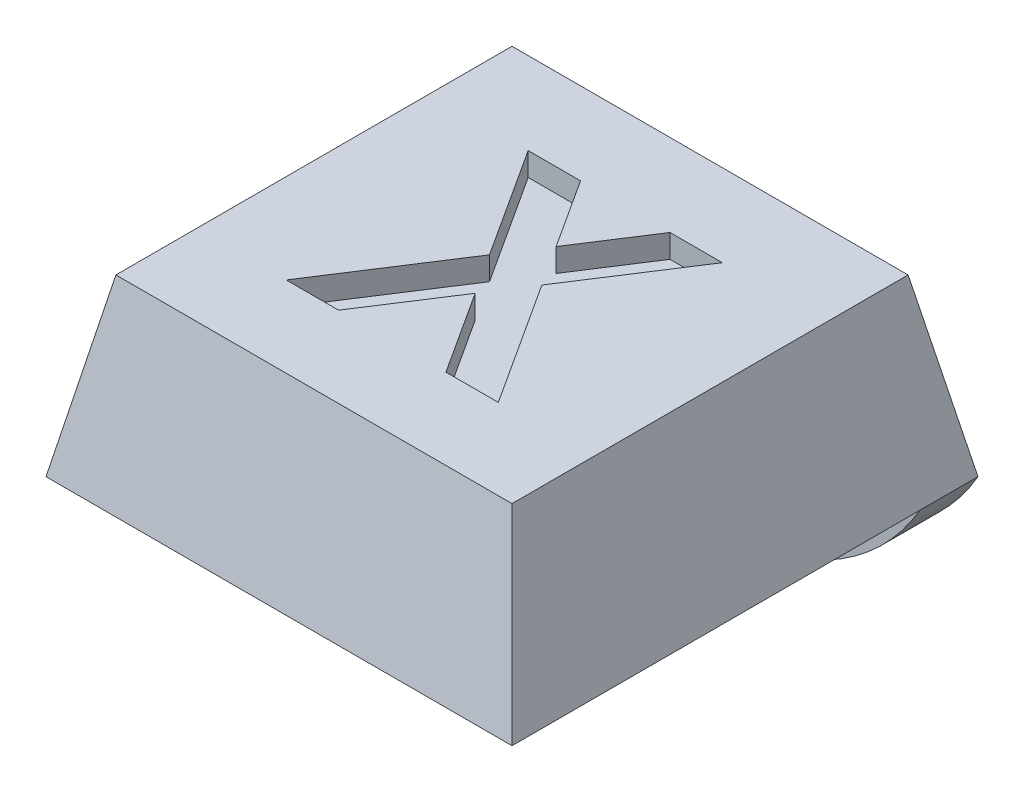
ISO-10303-21;
HEADER;
FILE_DESCRIPTION(('STEP AP214'),'2;1');
FILE_NAME('part.step','',(''),(''),'','','');
FILE_SCHEMA(('AUTOMOTIVE_DESIGN { 1 0 10303 214 1 1 1 1 }'));
ENDSEC;
DATA;
#1=APPLICATION_CONTEXT('core data for automotive mechanical design processes');
#2=APPLICATION_PROTOCOL_DEFINITION('international standard','automotive_design',2000,#1);
#3=PRODUCT_CONTEXT('',#1,'mechanical');
#4=PRODUCT('Part','Part','',(#3));
#5=PRODUCT_RELATED_PRODUCT_CATEGORY('part','',(#4));
#6=PRODUCT_DEFINITION_FORMATION('','',#4);
#7=PRODUCT_DEFINITION_CONTEXT('part definition',#1,'design');
#8=PRODUCT_DEFINITION('design','',#6,#7);
#9=PRODUCT_DEFINITION_SHAPE('','',#8);
#10=(LENGTH_UNIT() NAMED_UNIT(*) SI_UNIT(.MILLI.,.METRE.));
#11=(NAMED_UNIT(*) PLANE_ANGLE_UNIT() SI_UNIT($,.RADIAN.));
#12=(NAMED_UNIT(*) SI_UNIT($,.STERADIAN.) SOLID_ANGLE_UNIT());
#13=UNCERTAINTY_MEASURE_WITH_UNIT(LENGTH_MEASURE(1.E-05),#10,'distance_accuracy_value','');
#14=(GEOMETRIC_REPRESENTATION_CONTEXT(3) GLOBAL_UNCERTAINTY_ASSIGNED_CONTEXT((#13)) GLOBAL_UNIT_ASSIGNED_CONTEXT((#10,
#11,#12)) REPRESENTATION_CONTEXT('',''));
#15=CARTESIAN_POINT('',(0.,0.,0.));
#16=DIRECTION('',(0.,0.,1.));
#17=DIRECTION('',(1.,0.,0.));
#18=AXIS2_PLACEMENT_3D('',#15,#16,#17);
#19=CARTESIAN_POINT('',(0.,3.,0.));
#20=DIRECTION('',(0.,-1.,0.));
#21=DIRECTION('',(0.,0.,-1.));
#22=AXIS2_PLACEMENT_3D('',#19,#20,#21);
#23=PLANE('',#22);
#24=DIRECTION('',(-1.,0.,0.));
#25=VECTOR('',#24,1.);
#26=CARTESIAN_POINT('',(11.,3.,-0.6));
#27=LINE('',#26,#25);
#28=CARTESIAN_POINT('',(7.4,3.,-0.6));
#29=VERTEX_POINT('',#28);
#30=CARTESIAN_POINT('',(0.6,3.,-0.6));
#31=VERTEX_POINT('',#30);
#32=EDGE_CURVE('E229',#29,#31,#27,.T.);
#33=ORIENTED_EDGE('',*,*,#32,.F.);
#34=DIRECTION('',(0.,0.,1.));
#35=VECTOR('',#34,1.);
#36=CARTESIAN_POINT('',(7.4,3.,-8.));
#37=LINE('',#36,#35);
#38=CARTESIAN_POINT('',(7.4,3.,-7.4));
#39=VERTEX_POINT('',#38);
#40=EDGE_CURVE('E242',#39,#29,#37,.T.);
#41=ORIENTED_EDGE('',*,*,#40,.F.);
#42=DIRECTION('',(-1.,0.,0.));
#43=VECTOR('',#42,1.);
#44=CARTESIAN_POINT('',(11.,3.,-7.4));
#45=LINE('',#44,#43);
#46=CARTESIAN_POINT('',(0.599999999999999,3.,-7.4));
#47=VERTEX_POINT('',#46);
#48=EDGE_CURVE('E225',#39,#47,#45,.T.);
#49=ORIENTED_EDGE('',*,*,#48,.T.);
#50=DIRECTION('',(0.,0.,1.));
#51=VECTOR('',#50,1.);
#52=CARTESIAN_POINT('',(0.6,3.,-8.));
#53=LINE('',#52,#51);
#54=EDGE_CURVE('E245',#47,#31,#53,.T.);
#55=ORIENTED_EDGE('',*,*,#54,.T.);
#56=EDGE_LOOP('',(#33,#41,#49,#55));
#57=FACE_BOUND('',#56,.T.);
#58=DIRECTION('',(-1.,0.,0.));
#59=VECTOR('',#58,1.);
#60=CARTESIAN_POINT('',(3.03551556297444,3.,-1.98743460523464));
#61=LINE('',#60,#59);
#62=CARTESIAN_POINT('',(3.03551556297444,3.,-1.98743460523464));
#63=VERTEX_POINT('',#62);
#64=CARTESIAN_POINT('',(2.13647710143598,3.,-1.98743460523464));
#65=VERTEX_POINT('',#64);
#66=EDGE_CURVE('E58',#63,#65,#61,.T.);
#67=ORIENTED_EDGE('',*,*,#66,.T.);
#68=DIRECTION('',(0.543290774968153,0.,-0.839544599074107));
#69=VECTOR('',#68,1.);
#70=CARTESIAN_POINT('',(2.13647710143598,3.,-1.98743460523464));
#71=LINE('',#70,#69);
#72=CARTESIAN_POINT('',(3.50747069117957,3.,-4.10602434882438));
#73=VERTEX_POINT('',#72);
#74=EDGE_CURVE('E197',#65,#73,#71,.T.);
#75=ORIENTED_EDGE('',*,*,#74,.T.);
#76=DIRECTION('',(-0.543177141809505,0.,-0.839618123086714));
#77=VECTOR('',#76,1.);
#78=CARTESIAN_POINT('',(3.50747069117957,3.,-4.10602434882438));
#79=LINE('',#78,#77);
#80=CARTESIAN_POINT('',(2.29032325528213,3.,-5.98743460523464));
#81=VERTEX_POINT('',#80);
#82=EDGE_CURVE('E666',#73,#81,#79,.T.);
#83=ORIENTED_EDGE('',*,*,#82,.T.);
#84=DIRECTION('',(1.,0.,0.));
#85=VECTOR('',#84,1.);
#86=CARTESIAN_POINT('',(2.29032325528213,3.,-5.98743460523464));
#87=LINE('',#86,#85);
#88=CARTESIAN_POINT('',(3.18936171682059,3.,-5.98743460523464));
#89=VERTEX_POINT('',#88);
#90=EDGE_CURVE('E668',#81,#89,#87,.T.);
#91=ORIENTED_EDGE('',*,*,#90,.T.);
#92=DIRECTION('',(0.543133735363525,0.,0.839646202581816));
#93=VECTOR('',#92,1.);
#94=CARTESIAN_POINT('',(3.18936171682059,3.,-5.98743460523464));
#95=LINE('',#94,#93);
#96=CARTESIAN_POINT('',(3.9569899219488,3.,-4.80073588728592));
#97=VERTEX_POINT('',#96);
#98=EDGE_CURVE('E673',#89,#97,#95,.T.);
#99=ORIENTED_EDGE('',*,*,#98,.T.);
#100=DIRECTION('',(0.543133735363525,0.,-0.839646202581816));
#101=VECTOR('',#100,1.);
#102=CARTESIAN_POINT('',(3.9569899219488,3.,-4.80073588728592));
#103=LINE('',#102,#101);
#104=CARTESIAN_POINT('',(4.724618127077,3.,-5.98743460523464));
#105=VERTEX_POINT('',#104);
#106=EDGE_CURVE('E683',#97,#105,#103,.T.);
#107=ORIENTED_EDGE('',*,*,#106,.T.);
#108=DIRECTION('',(1.,0.,0.));
#109=VECTOR('',#108,1.);
#110=CARTESIAN_POINT('',(4.724618127077,3.,-5.98743460523464));
#111=LINE('',#110,#109);
#112=CARTESIAN_POINT('',(5.62365658861547,3.,-5.98743460523464));
#113=VERTEX_POINT('',#112);
#114=EDGE_CURVE('E687',#105,#113,#111,.T.);
#115=ORIENTED_EDGE('',*,*,#114,.T.);
#116=DIRECTION('',(-0.543177141809505,0.,0.839618123086714));
#117=VECTOR('',#116,1.);
#118=CARTESIAN_POINT('',(5.62365658861547,3.,-5.98743460523464));
#119=LINE('',#118,#117);
#120=CARTESIAN_POINT('',(4.40650915271803,3.,-4.10602434882438));
#121=VERTEX_POINT('',#120);
#122=EDGE_CURVE('E691',#113,#121,#119,.T.);
#123=ORIENTED_EDGE('',*,*,#122,.T.);
#124=DIRECTION('',(0.543290774968153,0.,0.839544599074107));
#125=VECTOR('',#124,1.);
#126=CARTESIAN_POINT('',(4.40650915271803,3.,-4.10602434882438));
#127=LINE('',#126,#125);
#128=CARTESIAN_POINT('',(5.77750274246162,3.,-1.98743460523464));
#129=VERTEX_POINT('',#128);
#130=EDGE_CURVE('E632',#121,#129,#127,.T.);
#131=ORIENTED_EDGE('',*,*,#130,.T.);
#132=DIRECTION('',(-1.,0.,0.));
#133=VECTOR('',#132,1.);
#134=CARTESIAN_POINT('',(5.77750274246162,3.,-1.98743460523464));
#135=LINE('',#134,#133);
#136=CARTESIAN_POINT('',(4.87846428092316,3.,-1.98743460523464));
#137=VERTEX_POINT('',#136);
#138=EDGE_CURVE('E627',#129,#137,#135,.T.);
#139=ORIENTED_EDGE('',*,*,#138,.T.);
#140=DIRECTION('',(-0.543310044190695,0.,-0.839532129153795));
#141=VECTOR('',#140,1.);
#142=CARTESIAN_POINT('',(4.87846428092316,3.,-1.98743460523464));
#143=LINE('',#142,#141);
#144=CARTESIAN_POINT('',(3.9569899219488,3.,-3.41131281036285));
#145=VERTEX_POINT('',#144);
#146=EDGE_CURVE('E621',#137,#145,#143,.T.);
#147=ORIENTED_EDGE('',*,*,#146,.T.);
#148=DIRECTION('',(-0.543310044190695,0.,0.839532129153795));
#149=VECTOR('',#148,1.);
#150=CARTESIAN_POINT('',(3.9569899219488,3.,-3.41131281036285));
#151=LINE('',#150,#149);
#152=EDGE_CURVE('E193',#145,#63,#151,.T.);
#153=ORIENTED_EDGE('',*,*,#152,.T.);
#154=EDGE_LOOP('',(#67,#75,#83,#91,#99,#107,#115,#123,#131,#139,#147,#153));
#155=FACE_BOUND('',#154,.T.);
#156=ADVANCED_FACE('F42',(#57,#155),#23,.F.);
#157=CARTESIAN_POINT('',(8.,0.,-8.));
#158=DIRECTION('',(-0.98058067569092,-0.196116135138184,0.));
#159=DIRECTION('',(0.196116135138184,-0.98058067569092,0.));
#160=AXIS2_PLACEMENT_3D('',#157,#158,#159);
#161=PLANE('',#160);
#162=DIRECTION('',(-0.192450089729875,0.962250448649376,-0.192450089729875));
#163=VECTOR('',#162,1.);
#164=CARTESIAN_POINT('',(7.7037037037037,1.48148148148148,-0.296296296296296));
#165=LINE('',#164,#163);
#166=CARTESIAN_POINT('',(8.,0.,0.));
#167=VERTEX_POINT('',#166);
#168=EDGE_CURVE('E239',#167,#29,#165,.T.);
#169=ORIENTED_EDGE('',*,*,#168,.F.);
#170=DIRECTION('',(0.,0.,-1.));
#171=VECTOR('',#170,1.);
#172=CARTESIAN_POINT('',(8.,0.,0.));
#173=LINE('',#172,#171);
#174=CARTESIAN_POINT('',(8.,0.,-7.));
#175=VERTEX_POINT('',#174);
#176=EDGE_CURVE('E258',#167,#175,#173,.T.);
#177=ORIENTED_EDGE('',*,*,#176,.T.);
#178=DIRECTION('',(0.,0.,1.));
#179=VECTOR('',#178,1.);
#180=CARTESIAN_POINT('',(8.,0.,-8.));
#181=LINE('',#180,#179);
#182=CARTESIAN_POINT('',(8.,0.,-8.));
#183=VERTEX_POINT('',#182);
#184=EDGE_CURVE('E199',#183,#175,#181,.T.);
#185=ORIENTED_EDGE('',*,*,#184,.F.);
#186=DIRECTION('',(0.192450089729875,-0.962250448649376,-0.192450089729875));
#187=VECTOR('',#186,1.);
#188=CARTESIAN_POINT('',(8.,0.,-8.));
#189=LINE('',#188,#187);
#190=EDGE_CURVE('E232',#39,#183,#189,.T.);
#191=ORIENTED_EDGE('',*,*,#190,.F.);
#192=ORIENTED_EDGE('',*,*,#40,.T.);
#193=EDGE_LOOP('',(#169,#177,#185,#191,#192));
#194=FACE_BOUND('',#193,.T.);
#195=ADVANCED_FACE('F326',(#194),#161,.F.);
#196=CARTESIAN_POINT('',(0.,0.,-8.));
#197=DIRECTION('',(0.98058067569092,-0.196116135138184,0.));
#198=DIRECTION('',(0.196116135138184,0.98058067569092,0.));
#199=AXIS2_PLACEMENT_3D('',#196,#197,#198);
#200=PLANE('',#199);
#201=DIRECTION('',(-0.192450089729875,-0.962250448649376,0.192450089729875));
#202=VECTOR('',#201,1.);
#203=CARTESIAN_POINT('',(0.296296296296296,1.48148148148148,-0.296296296296296));
#204=LINE('',#203,#202);
#205=CARTESIAN_POINT('',(0.,0.,0.));
#206=VERTEX_POINT('',#205);
#207=EDGE_CURVE('E286',#31,#206,#204,.T.);
#208=ORIENTED_EDGE('',*,*,#207,.F.);
#209=ORIENTED_EDGE('',*,*,#54,.F.);
#210=DIRECTION('',(0.192450089729875,0.962250448649376,0.192450089729875));
#211=VECTOR('',#210,1.);
#212=CARTESIAN_POINT('',(0.,0.,-8.));
#213=LINE('',#212,#211);
#214=CARTESIAN_POINT('',(0.,0.,-8.));
#215=VERTEX_POINT('',#214);
#216=EDGE_CURVE('E257',#215,#47,#213,.T.);
#217=ORIENTED_EDGE('',*,*,#216,.F.);
#218=DIRECTION('',(0.,0.,1.));
#219=VECTOR('',#218,1.);
#220=CARTESIAN_POINT('',(0.,0.,0.));
#221=LINE('',#220,#219);
#222=CARTESIAN_POINT('',(0.,0.,-7.));
#223=VERTEX_POINT('',#222);
#224=EDGE_CURVE('E262',#215,#223,#221,.T.);
#225=ORIENTED_EDGE('',*,*,#224,.T.);
#226=EDGE_CURVE('E249',#223,#206,#221,.T.);
#227=ORIENTED_EDGE('',*,*,#226,.T.);
#228=EDGE_LOOP('',(#208,#209,#217,#225,#227));
#229=FACE_BOUND('',#228,.T.);
#230=ADVANCED_FACE('F310',(#229),#200,.F.);
#231=CARTESIAN_POINT('',(0.,0.,0.));
#232=DIRECTION('',(0.,-1.,0.));
#233=DIRECTION('',(0.,0.,-1.));
#234=AXIS2_PLACEMENT_3D('',#231,#232,#233);
#235=PLANE('',#234);
#236=DIRECTION('',(-1.,0.,0.));
#237=VECTOR('',#236,1.);
#238=CARTESIAN_POINT('',(0.,0.,-7.));
#239=LINE('',#238,#237);
#240=EDGE_CURVE('E205',#175,#223,#239,.T.);
#241=ORIENTED_EDGE('',*,*,#240,.F.);
#242=ORIENTED_EDGE('',*,*,#176,.F.);
#243=DIRECTION('',(1.,0.,0.));
#244=VECTOR('',#243,1.);
#245=CARTESIAN_POINT('',(0.,0.,0.));
#246=LINE('',#245,#244);
#247=EDGE_CURVE('E259',#206,#167,#246,.T.);
#248=ORIENTED_EDGE('',*,*,#247,.F.);
#249=ORIENTED_EDGE('',*,*,#226,.F.);
#250=EDGE_LOOP('',(#241,#242,#248,#249));
#251=FACE_BOUND('',#250,.T.);
#252=CARTESIAN_POINT('',(4.,0.,-3.75));
#253=DIRECTION('',(0.,-1.,0.));
#254=DIRECTION('',(0.,0.,-1.));
#255=AXIS2_PLACEMENT_3D('',#252,#253,#254);
#256=CIRCLE('',#255,1.8);
#257=CARTESIAN_POINT('',(4.,0.,-5.55));
#258=VERTEX_POINT('',#257);
#259=EDGE_CURVE('E217',#258,#258,#256,.T.);
#260=ORIENTED_EDGE('',*,*,#259,.F.);
#261=EDGE_LOOP('',(#260));
#262=FACE_BOUND('',#261,.T.);
#263=ADVANCED_FACE('F321',(#251,#262),#235,.T.);
#264=CARTESIAN_POINT('',(11.,3.,-7.4));
#265=DIRECTION('',(0.,0.196116135138184,-0.98058067569092));
#266=DIRECTION('',(0.,0.98058067569092,0.196116135138184));
#267=AXIS2_PLACEMENT_3D('',#264,#265,#266);
#268=PLANE('',#267);
#269=ORIENTED_EDGE('',*,*,#190,.T.);
#270=DIRECTION('',(-1.,0.,0.));
#271=VECTOR('',#270,1.);
#272=CARTESIAN_POINT('',(0.,0.,-8.));
#273=LINE('',#272,#271);
#274=EDGE_CURVE('E253',#183,#215,#273,.T.);
#275=ORIENTED_EDGE('',*,*,#274,.T.);
#276=ORIENTED_EDGE('',*,*,#216,.T.);
#277=ORIENTED_EDGE('',*,*,#48,.F.);
#278=EDGE_LOOP('',(#269,#275,#276,#277));
#279=FACE_BOUND('',#278,.T.);
#280=ADVANCED_FACE('F305',(#279),#268,.T.);
#281=CARTESIAN_POINT('',(11.,0.,0.));
#282=DIRECTION('',(0.,0.196116135138184,0.98058067569092));
#283=DIRECTION('',(0.,-0.98058067569092,0.196116135138184));
#284=AXIS2_PLACEMENT_3D('',#281,#282,#283);
#285=PLANE('',#284);
#286=ORIENTED_EDGE('',*,*,#168,.T.);
#287=ORIENTED_EDGE('',*,*,#32,.T.);
#288=ORIENTED_EDGE('',*,*,#207,.T.);
#289=ORIENTED_EDGE('',*,*,#247,.T.);
#290=EDGE_LOOP('',(#286,#287,#288,#289));
#291=FACE_BOUND('',#290,.T.);
#292=ADVANCED_FACE('F352',(#291),#285,.T.);
#293=CARTESIAN_POINT('',(4.,0.8,-3.75));
#294=DIRECTION('',(0.,-1.,0.));
#295=DIRECTION('',(0.,0.,-1.));
#296=AXIS2_PLACEMENT_3D('',#293,#294,#295);
#297=CYLINDRICAL_SURFACE('',#296,1.8);
#298=CARTESIAN_POINT('',(4.,0.8,-3.75));
#299=DIRECTION('',(0.,-1.,0.));
#300=DIRECTION('',(0.,0.,-1.));
#301=AXIS2_PLACEMENT_3D('',#298,#299,#300);
#302=CIRCLE('',#301,1.8);
#303=CARTESIAN_POINT('',(4.,0.8,-5.55));
#304=VERTEX_POINT('',#303);
#305=EDGE_CURVE('E221',#304,#304,#302,.T.);
#306=ORIENTED_EDGE('',*,*,#305,.F.);
#307=EDGE_LOOP('',(#306));
#308=FACE_BOUND('',#307,.T.);
#309=ORIENTED_EDGE('',*,*,#259,.T.);
#310=EDGE_LOOP('',(#309));
#311=FACE_BOUND('',#310,.T.);
#312=ADVANCED_FACE('F359',(#308,#311),#297,.F.);
#313=CARTESIAN_POINT('',(4.,0.8,-3.75));
#314=DIRECTION('',(0.,-1.,0.));
#315=DIRECTION('',(0.,0.,-1.));
#316=AXIS2_PLACEMENT_3D('',#313,#314,#315);
#317=PLANE('',#316);
#318=ORIENTED_EDGE('',*,*,#305,.T.);
#319=EDGE_LOOP('',(#318));
#320=FACE_BOUND('',#319,.T.);
#321=ADVANCED_FACE('F363',(#320),#317,.T.);
#322=CARTESIAN_POINT('',(0.,-2.,-8.));
#323=DIRECTION('',(0.,0.,1.));
#324=DIRECTION('',(1.,0.,0.));
#325=AXIS2_PLACEMENT_3D('',#322,#323,#324);
#326=PLANE('',#325);
#327=ORIENTED_EDGE('',*,*,#274,.F.);
#328=CARTESIAN_POINT('',(4.53589838486225,2.,-8.));
#329=DIRECTION('',(0.,0.,1.));
#330=DIRECTION('',(1.,0.,0.));
#331=AXIS2_PLACEMENT_3D('',#328,#329,#330);
#332=CIRCLE('',#331,4.);
#333=CARTESIAN_POINT('',(4.53589838486225,-2.,-8.));
#334=VERTEX_POINT('',#333);
#335=EDGE_CURVE('E11',#183,#334,#332,.F.);
#336=ORIENTED_EDGE('',*,*,#335,.T.);
#337=DIRECTION('',(1.,0.,0.));
#338=VECTOR('',#337,1.);
#339=CARTESIAN_POINT('',(0.,-2.,-8.));
#340=LINE('',#339,#338);
#341=CARTESIAN_POINT('',(3.46410161513775,-2.,-8.));
#342=VERTEX_POINT('',#341);
#343=EDGE_CURVE('E211',#342,#334,#340,.T.);
#344=ORIENTED_EDGE('',*,*,#343,.F.);
#345=CARTESIAN_POINT('',(3.46410161513775,2.,-8.));
#346=DIRECTION('',(0.,0.,1.));
#347=DIRECTION('',(1.,0.,0.));
#348=AXIS2_PLACEMENT_3D('',#345,#346,#347);
#349=CIRCLE('',#348,4.);
#350=EDGE_CURVE('E51',#342,#215,#349,.F.);
#351=ORIENTED_EDGE('',*,*,#350,.T.);
#352=EDGE_LOOP('',(#327,#336,#344,#351));
#353=FACE_BOUND('',#352,.T.);
#354=ADVANCED_FACE('F298',(#353),#326,.F.);
#355=CARTESIAN_POINT('',(0.,-2.,-7.));
#356=DIRECTION('',(0.,0.,-1.));
#357=DIRECTION('',(-1.,0.,0.));
#358=AXIS2_PLACEMENT_3D('',#355,#356,#357);
#359=PLANE('',#358);
#360=DIRECTION('',(-1.,0.,0.));
#361=VECTOR('',#360,1.);
#362=CARTESIAN_POINT('',(0.,-2.,-7.));
#363=LINE('',#362,#361);
#364=CARTESIAN_POINT('',(4.53589838486225,-2.,-7.));
#365=VERTEX_POINT('',#364);
#366=CARTESIAN_POINT('',(3.46410161513775,-2.,-7.));
#367=VERTEX_POINT('',#366);
#368=EDGE_CURVE('E215',#365,#367,#363,.T.);
#369=ORIENTED_EDGE('',*,*,#368,.F.);
#370=CARTESIAN_POINT('',(4.53589838486225,2.,-7.));
#371=DIRECTION('',(0.,0.,-1.));
#372=DIRECTION('',(-1.,0.,0.));
#373=AXIS2_PLACEMENT_3D('',#370,#371,#372);
#374=CIRCLE('',#373,4.);
#375=EDGE_CURVE('E292',#365,#175,#374,.F.);
#376=ORIENTED_EDGE('',*,*,#375,.T.);
#377=ORIENTED_EDGE('',*,*,#240,.T.);
#378=CARTESIAN_POINT('',(3.46410161513775,2.,-7.));
#379=DIRECTION('',(0.,0.,-1.));
#380=DIRECTION('',(-1.,0.,0.));
#381=AXIS2_PLACEMENT_3D('',#378,#379,#380);
#382=CIRCLE('',#381,4.);
#383=EDGE_CURVE('E66',#223,#367,#382,.F.);
#384=ORIENTED_EDGE('',*,*,#383,.T.);
#385=EDGE_LOOP('',(#369,#376,#377,#384));
#386=FACE_BOUND('',#385,.T.);
#387=ADVANCED_FACE('F316',(#386),#359,.F.);
#388=CARTESIAN_POINT('',(0.,-2.,0.));
#389=DIRECTION('',(0.,1.,0.));
#390=DIRECTION('',(0.,0.,1.));
#391=AXIS2_PLACEMENT_3D('',#388,#389,#390);
#392=PLANE('',#391);
#393=ORIENTED_EDGE('',*,*,#343,.T.);
#394=DIRECTION('',(0.,0.,1.));
#395=VECTOR('',#394,1.);
#396=CARTESIAN_POINT('',(4.53589838486225,-2.,0.));
#397=LINE('',#396,#395);
#398=EDGE_CURVE('E285',#334,#365,#397,.T.);
#399=ORIENTED_EDGE('',*,*,#398,.T.);
#400=ORIENTED_EDGE('',*,*,#368,.T.);
#401=DIRECTION('',(0.,0.,-1.));
#402=VECTOR('',#401,1.);
#403=CARTESIAN_POINT('',(3.46410161513775,-2.,0.));
#404=LINE('',#403,#402);
#405=EDGE_CURVE('E281',#367,#342,#404,.T.);
#406=ORIENTED_EDGE('',*,*,#405,.T.);
#407=EDGE_LOOP('',(#393,#399,#400,#406));
#408=FACE_BOUND('',#407,.T.);
#409=ADVANCED_FACE('F314',(#408),#392,.F.);
#410=CARTESIAN_POINT('',(4.53589838486225,2.,-8.));
#411=DIRECTION('',(0.,0.,1.));
#412=DIRECTION('',(1.,0.,0.));
#413=AXIS2_PLACEMENT_3D('',#410,#411,#412);
#414=CYLINDRICAL_SURFACE('',#413,4.);
#415=ORIENTED_EDGE('',*,*,#335,.F.);
#416=ORIENTED_EDGE('',*,*,#184,.T.);
#417=ORIENTED_EDGE('',*,*,#375,.F.);
#418=ORIENTED_EDGE('',*,*,#398,.F.);
#419=EDGE_LOOP('',(#415,#416,#417,#418));
#420=FACE_BOUND('',#419,.T.);
#421=ADVANCED_FACE('F327',(#420),#414,.T.);
#422=CARTESIAN_POINT('',(3.46410161513775,2.,-8.));
#423=DIRECTION('',(0.,0.,-1.));
#424=DIRECTION('',(-1.,0.,0.));
#425=AXIS2_PLACEMENT_3D('',#422,#423,#424);
#426=CYLINDRICAL_SURFACE('',#425,4.);
#427=ORIENTED_EDGE('',*,*,#383,.F.);
#428=ORIENTED_EDGE('',*,*,#224,.F.);
#429=ORIENTED_EDGE('',*,*,#350,.F.);
#430=ORIENTED_EDGE('',*,*,#405,.F.);
#431=EDGE_LOOP('',(#427,#428,#429,#430));
#432=FACE_BOUND('',#431,.T.);
#433=ADVANCED_FACE('F44',(#432),#426,.T.);
#434=CARTESIAN_POINT('',(3.03551556297444,2.6,-1.98743460523464));
#435=DIRECTION('',(0.,0.,-1.));
#436=DIRECTION('',(-1.,0.,0.));
#437=AXIS2_PLACEMENT_3D('',#434,#435,#436);
#438=PLANE('',#437);
#439=ORIENTED_EDGE('',*,*,#66,.F.);
#440=DIRECTION('',(0.,1.,0.));
#441=VECTOR('',#440,1.);
#442=CARTESIAN_POINT('',(3.03551556297444,2.6,-1.98743460523464));
#443=LINE('',#442,#441);
#444=CARTESIAN_POINT('',(3.03551556297444,2.6,-1.98743460523464));
#445=VERTEX_POINT('',#444);
#446=EDGE_CURVE('E191',#445,#63,#443,.T.);
#447=ORIENTED_EDGE('',*,*,#446,.F.);
#448=DIRECTION('',(-1.,0.,0.));
#449=VECTOR('',#448,1.);
#450=CARTESIAN_POINT('',(3.03551556297444,2.6,-1.98743460523464));
#451=LINE('',#450,#449);
#452=CARTESIAN_POINT('',(2.13647710143598,2.6,-1.98743460523464));
#453=VERTEX_POINT('',#452);
#454=EDGE_CURVE('E181',#445,#453,#451,.T.);
#455=ORIENTED_EDGE('',*,*,#454,.T.);
#456=DIRECTION('',(0.,1.,0.));
#457=VECTOR('',#456,1.);
#458=CARTESIAN_POINT('',(2.13647710143598,2.6,-1.98743460523464));
#459=LINE('',#458,#457);
#460=EDGE_CURVE('E190',#453,#65,#459,.T.);
#461=ORIENTED_EDGE('',*,*,#460,.T.);
#462=EDGE_LOOP('',(#439,#447,#455,#461));
#463=FACE_BOUND('',#462,.T.);
#464=ADVANCED_FACE('F189',(#463),#438,.T.);
#465=CARTESIAN_POINT('',(2.13647710143598,2.6,-1.98743460523464));
#466=DIRECTION('',(0.839544599074107,0.,0.543290774968153));
#467=DIRECTION('',(0.543290774968153,0.,-0.839544599074107));
#468=AXIS2_PLACEMENT_3D('',#465,#466,#467);
#469=PLANE('',#468);
#470=ORIENTED_EDGE('',*,*,#74,.F.);
#471=ORIENTED_EDGE('',*,*,#460,.F.);
#472=DIRECTION('',(0.543290774968153,0.,-0.839544599074107));
#473=VECTOR('',#472,1.);
#474=CARTESIAN_POINT('',(2.13647710143598,2.6,-1.98743460523464));
#475=LINE('',#474,#473);
#476=CARTESIAN_POINT('',(3.50747069117957,2.6,-4.10602434882438));
#477=VERTEX_POINT('',#476);
#478=EDGE_CURVE('E177',#453,#477,#475,.T.);
#479=ORIENTED_EDGE('',*,*,#478,.T.);
#480=DIRECTION('',(0.,1.,0.));
#481=VECTOR('',#480,1.);
#482=CARTESIAN_POINT('',(3.50747069117957,2.6,-4.10602434882438));
#483=LINE('',#482,#481);
#484=EDGE_CURVE('E200',#477,#73,#483,.T.);
#485=ORIENTED_EDGE('',*,*,#484,.T.);
#486=EDGE_LOOP('',(#470,#471,#479,#485));
#487=FACE_BOUND('',#486,.T.);
#488=ADVANCED_FACE('F195',(#487),#469,.T.);
#489=CARTESIAN_POINT('',(3.50747069117957,2.6,-4.10602434882438));
#490=DIRECTION('',(0.839618123086714,0.,-0.543177141809505));
#491=DIRECTION('',(-0.543177141809505,0.,-0.839618123086714));
#492=AXIS2_PLACEMENT_3D('',#489,#490,#491);
#493=PLANE('',#492);
#494=ORIENTED_EDGE('',*,*,#82,.F.);
#495=ORIENTED_EDGE('',*,*,#484,.F.);
#496=DIRECTION('',(-0.543177141809505,0.,-0.839618123086714));
#497=VECTOR('',#496,1.);
#498=CARTESIAN_POINT('',(3.50747069117957,2.6,-4.10602434882438));
#499=LINE('',#498,#497);
#500=CARTESIAN_POINT('',(2.29032325528213,2.6,-5.98743460523464));
#501=VERTEX_POINT('',#500);
#502=EDGE_CURVE('E183',#477,#501,#499,.T.);
#503=ORIENTED_EDGE('',*,*,#502,.T.);
#504=DIRECTION('',(0.,1.,0.));
#505=VECTOR('',#504,1.);
#506=CARTESIAN_POINT('',(2.29032325528213,2.6,-5.98743460523464));
#507=LINE('',#506,#505);
#508=EDGE_CURVE('E207',#501,#81,#507,.T.);
#509=ORIENTED_EDGE('',*,*,#508,.T.);
#510=EDGE_LOOP('',(#494,#495,#503,#509));
#511=FACE_BOUND('',#510,.T.);
#512=ADVANCED_FACE('F376',(#511),#493,.T.);
#513=CARTESIAN_POINT('',(2.29032325528213,2.6,-5.98743460523464));
#514=DIRECTION('',(0.,0.,1.));
#515=DIRECTION('',(1.,0.,0.));
#516=AXIS2_PLACEMENT_3D('',#513,#514,#515);
#517=PLANE('',#516);
#518=ORIENTED_EDGE('',*,*,#90,.F.);
#519=ORIENTED_EDGE('',*,*,#508,.F.);
#520=DIRECTION('',(1.,0.,0.));
#521=VECTOR('',#520,1.);
#522=CARTESIAN_POINT('',(2.29032325528213,2.6,-5.98743460523464));
#523=LINE('',#522,#521);
#524=CARTESIAN_POINT('',(3.18936171682059,2.6,-5.98743460523464));
#525=VERTEX_POINT('',#524);
#526=EDGE_CURVE('E727',#501,#525,#523,.T.);
#527=ORIENTED_EDGE('',*,*,#526,.T.);
#528=DIRECTION('',(0.,1.,0.));
#529=VECTOR('',#528,1.);
#530=CARTESIAN_POINT('',(3.18936171682059,2.6,-5.98743460523464));
#531=LINE('',#530,#529);
#532=EDGE_CURVE('E659',#525,#89,#531,.T.);
#533=ORIENTED_EDGE('',*,*,#532,.T.);
#534=EDGE_LOOP('',(#518,#519,#527,#533));
#535=FACE_BOUND('',#534,.T.);
#536=ADVANCED_FACE('F379',(#535),#517,.T.);
#537=CARTESIAN_POINT('',(3.18936171682059,2.6,-5.98743460523464));
#538=DIRECTION('',(-0.839646202581816,0.,0.543133735363525));
#539=DIRECTION('',(0.543133735363525,0.,0.839646202581816));
#540=AXIS2_PLACEMENT_3D('',#537,#538,#539);
#541=PLANE('',#540);
#542=ORIENTED_EDGE('',*,*,#98,.F.);
#543=ORIENTED_EDGE('',*,*,#532,.F.);
#544=DIRECTION('',(0.543133735363525,0.,0.839646202581816));
#545=VECTOR('',#544,1.);
#546=CARTESIAN_POINT('',(3.18936171682059,2.6,-5.98743460523464));
#547=LINE('',#546,#545);
#548=CARTESIAN_POINT('',(3.9569899219488,2.6,-4.80073588728592));
#549=VERTEX_POINT('',#548);
#550=EDGE_CURVE('E724',#525,#549,#547,.T.);
#551=ORIENTED_EDGE('',*,*,#550,.T.);
#552=DIRECTION('',(0.,1.,0.));
#553=VECTOR('',#552,1.);
#554=CARTESIAN_POINT('',(3.9569899219488,2.6,-4.80073588728592));
#555=LINE('',#554,#553);
#556=EDGE_CURVE('E656',#549,#97,#555,.T.);
#557=ORIENTED_EDGE('',*,*,#556,.T.);
#558=EDGE_LOOP('',(#542,#543,#551,#557));
#559=FACE_BOUND('',#558,.T.);
#560=ADVANCED_FACE('F383',(#559),#541,.T.);
#561=CARTESIAN_POINT('',(3.9569899219488,2.6,-4.80073588728592));
#562=DIRECTION('',(0.839646202581816,0.,0.543133735363525));
#563=DIRECTION('',(0.543133735363525,0.,-0.839646202581816));
#564=AXIS2_PLACEMENT_3D('',#561,#562,#563);
#565=PLANE('',#564);
#566=ORIENTED_EDGE('',*,*,#106,.F.);
#567=ORIENTED_EDGE('',*,*,#556,.F.);
#568=DIRECTION('',(0.543133735363525,0.,-0.839646202581816));
#569=VECTOR('',#568,1.);
#570=CARTESIAN_POINT('',(3.9569899219488,2.6,-4.80073588728592));
#571=LINE('',#570,#569);
#572=CARTESIAN_POINT('',(4.724618127077,2.6,-5.98743460523464));
#573=VERTEX_POINT('',#572);
#574=EDGE_CURVE('E721',#549,#573,#571,.T.);
#575=ORIENTED_EDGE('',*,*,#574,.T.);
#576=DIRECTION('',(0.,1.,0.));
#577=VECTOR('',#576,1.);
#578=CARTESIAN_POINT('',(4.724618127077,2.6,-5.98743460523464));
#579=LINE('',#578,#577);
#580=EDGE_CURVE('E653',#573,#105,#579,.T.);
#581=ORIENTED_EDGE('',*,*,#580,.T.);
#582=EDGE_LOOP('',(#566,#567,#575,#581));
#583=FACE_BOUND('',#582,.T.);
#584=ADVANCED_FACE('F387',(#583),#565,.T.);
#585=CARTESIAN_POINT('',(4.724618127077,2.6,-5.98743460523464));
#586=DIRECTION('',(0.,0.,1.));
#587=DIRECTION('',(1.,0.,0.));
#588=AXIS2_PLACEMENT_3D('',#585,#586,#587);
#589=PLANE('',#588);
#590=ORIENTED_EDGE('',*,*,#114,.F.);
#591=ORIENTED_EDGE('',*,*,#580,.F.);
#592=DIRECTION('',(1.,0.,0.));
#593=VECTOR('',#592,1.);
#594=CARTESIAN_POINT('',(4.724618127077,2.6,-5.98743460523464));
#595=LINE('',#594,#593);
#596=CARTESIAN_POINT('',(5.62365658861547,2.6,-5.98743460523464));
#597=VERTEX_POINT('',#596);
#598=EDGE_CURVE('E718',#573,#597,#595,.T.);
#599=ORIENTED_EDGE('',*,*,#598,.T.);
#600=DIRECTION('',(0.,1.,0.));
#601=VECTOR('',#600,1.);
#602=CARTESIAN_POINT('',(5.62365658861547,2.6,-5.98743460523464));
#603=LINE('',#602,#601);
#604=EDGE_CURVE('E650',#597,#113,#603,.T.);
#605=ORIENTED_EDGE('',*,*,#604,.T.);
#606=EDGE_LOOP('',(#590,#591,#599,#605));
#607=FACE_BOUND('',#606,.T.);
#608=ADVANCED_FACE('F391',(#607),#589,.T.);
#609=CARTESIAN_POINT('',(5.62365658861547,2.6,-5.98743460523464));
#610=DIRECTION('',(-0.839618123086714,0.,-0.543177141809505));
#611=DIRECTION('',(-0.543177141809505,0.,0.839618123086714));
#612=AXIS2_PLACEMENT_3D('',#609,#610,#611);
#613=PLANE('',#612);
#614=ORIENTED_EDGE('',*,*,#122,.F.);
#615=ORIENTED_EDGE('',*,*,#604,.F.);
#616=DIRECTION('',(-0.543177141809505,0.,0.839618123086714));
#617=VECTOR('',#616,1.);
#618=CARTESIAN_POINT('',(5.62365658861547,2.6,-5.98743460523464));
#619=LINE('',#618,#617);
#620=CARTESIAN_POINT('',(4.40650915271803,2.6,-4.10602434882438));
#621=VERTEX_POINT('',#620);
#622=EDGE_CURVE('E715',#597,#621,#619,.T.);
#623=ORIENTED_EDGE('',*,*,#622,.T.);
#624=DIRECTION('',(0.,1.,0.));
#625=VECTOR('',#624,1.);
#626=CARTESIAN_POINT('',(4.40650915271803,2.6,-4.10602434882438));
#627=LINE('',#626,#625);
#628=EDGE_CURVE('E647',#621,#121,#627,.T.);
#629=ORIENTED_EDGE('',*,*,#628,.T.);
#630=EDGE_LOOP('',(#614,#615,#623,#629));
#631=FACE_BOUND('',#630,.T.);
#632=ADVANCED_FACE('F395',(#631),#613,.T.);
#633=CARTESIAN_POINT('',(4.40650915271803,2.6,-4.10602434882438));
#634=DIRECTION('',(-0.839544599074107,0.,0.543290774968153));
#635=DIRECTION('',(0.543290774968153,0.,0.839544599074107));
#636=AXIS2_PLACEMENT_3D('',#633,#634,#635);
#637=PLANE('',#636);
#638=ORIENTED_EDGE('',*,*,#130,.F.);
#639=ORIENTED_EDGE('',*,*,#628,.F.);
#640=DIRECTION('',(0.543290774968153,0.,0.839544599074107));
#641=VECTOR('',#640,1.);
#642=CARTESIAN_POINT('',(4.40650915271803,2.6,-4.10602434882438));
#643=LINE('',#642,#641);
#644=CARTESIAN_POINT('',(5.77750274246162,2.6,-1.98743460523464));
#645=VERTEX_POINT('',#644);
#646=EDGE_CURVE('E700',#621,#645,#643,.T.);
#647=ORIENTED_EDGE('',*,*,#646,.T.);
#648=DIRECTION('',(0.,1.,0.));
#649=VECTOR('',#648,1.);
#650=CARTESIAN_POINT('',(5.77750274246162,2.6,-1.98743460523464));
#651=LINE('',#650,#649);
#652=EDGE_CURVE('E644',#645,#129,#651,.T.);
#653=ORIENTED_EDGE('',*,*,#652,.T.);
#654=EDGE_LOOP('',(#638,#639,#647,#653));
#655=FACE_BOUND('',#654,.T.);
#656=ADVANCED_FACE('F399',(#655),#637,.T.);
#657=CARTESIAN_POINT('',(5.77750274246162,2.6,-1.98743460523464));
#658=DIRECTION('',(0.,0.,-1.));
#659=DIRECTION('',(-1.,0.,0.));
#660=AXIS2_PLACEMENT_3D('',#657,#658,#659);
#661=PLANE('',#660);
#662=ORIENTED_EDGE('',*,*,#138,.F.);
#663=ORIENTED_EDGE('',*,*,#652,.F.);
#664=DIRECTION('',(-1.,0.,0.));
#665=VECTOR('',#664,1.);
#666=CARTESIAN_POINT('',(5.77750274246162,2.6,-1.98743460523464));
#667=LINE('',#666,#665);
#668=CARTESIAN_POINT('',(4.87846428092316,2.6,-1.98743460523464));
#669=VERTEX_POINT('',#668);
#670=EDGE_CURVE('E702',#645,#669,#667,.T.);
#671=ORIENTED_EDGE('',*,*,#670,.T.);
#672=DIRECTION('',(0.,1.,0.));
#673=VECTOR('',#672,1.);
#674=CARTESIAN_POINT('',(4.87846428092316,2.6,-1.98743460523464));
#675=LINE('',#674,#673);
#676=EDGE_CURVE('E641',#669,#137,#675,.T.);
#677=ORIENTED_EDGE('',*,*,#676,.T.);
#678=EDGE_LOOP('',(#662,#663,#671,#677));
#679=FACE_BOUND('',#678,.T.);
#680=ADVANCED_FACE('F403',(#679),#661,.T.);
#681=CARTESIAN_POINT('',(4.87846428092316,2.6,-1.98743460523464));
#682=DIRECTION('',(0.839532129153795,0.,-0.543310044190695));
#683=DIRECTION('',(-0.543310044190695,0.,-0.839532129153796));
#684=AXIS2_PLACEMENT_3D('',#681,#682,#683);
#685=PLANE('',#684);
#686=ORIENTED_EDGE('',*,*,#146,.F.);
#687=ORIENTED_EDGE('',*,*,#676,.F.);
#688=DIRECTION('',(-0.543310044190695,0.,-0.839532129153795));
#689=VECTOR('',#688,1.);
#690=CARTESIAN_POINT('',(4.87846428092316,2.6,-1.98743460523464));
#691=LINE('',#690,#689);
#692=CARTESIAN_POINT('',(3.9569899219488,2.6,-3.41131281036285));
#693=VERTEX_POINT('',#692);
#694=EDGE_CURVE('E704',#669,#693,#691,.T.);
#695=ORIENTED_EDGE('',*,*,#694,.T.);
#696=DIRECTION('',(0.,1.,0.));
#697=VECTOR('',#696,1.);
#698=CARTESIAN_POINT('',(3.9569899219488,2.6,-3.41131281036285));
#699=LINE('',#698,#697);
#700=EDGE_CURVE('E619',#693,#145,#699,.T.);
#701=ORIENTED_EDGE('',*,*,#700,.T.);
#702=EDGE_LOOP('',(#686,#687,#695,#701));
#703=FACE_BOUND('',#702,.T.);
#704=ADVANCED_FACE('F407',(#703),#685,.T.);
#705=CARTESIAN_POINT('',(3.9569899219488,2.6,-3.41131281036285));
#706=DIRECTION('',(-0.839532129153795,0.,-0.543310044190695));
#707=DIRECTION('',(-0.543310044190695,0.,0.839532129153796));
#708=AXIS2_PLACEMENT_3D('',#705,#706,#707);
#709=PLANE('',#708);
#710=ORIENTED_EDGE('',*,*,#152,.F.);
#711=ORIENTED_EDGE('',*,*,#700,.F.);
#712=DIRECTION('',(-0.543310044190695,0.,0.839532129153795));
#713=VECTOR('',#712,1.);
#714=CARTESIAN_POINT('',(3.9569899219488,2.6,-3.41131281036285));
#715=LINE('',#714,#713);
#716=EDGE_CURVE('E638',#693,#445,#715,.T.);
#717=ORIENTED_EDGE('',*,*,#716,.T.);
#718=ORIENTED_EDGE('',*,*,#446,.T.);
#719=EDGE_LOOP('',(#710,#711,#717,#718));
#720=FACE_BOUND('',#719,.T.);
#721=ADVANCED_FACE('F411',(#720),#709,.T.);
#722=CARTESIAN_POINT('',(0.,2.6,0.));
#723=DIRECTION('',(0.,1.,0.));
#724=DIRECTION('',(0.,0.,1.));
#725=AXIS2_PLACEMENT_3D('',#722,#723,#724);
#726=PLANE('',#725);
#727=ORIENTED_EDGE('',*,*,#454,.F.);
#728=ORIENTED_EDGE('',*,*,#716,.F.);
#729=ORIENTED_EDGE('',*,*,#694,.F.);
#730=ORIENTED_EDGE('',*,*,#670,.F.);
#731=ORIENTED_EDGE('',*,*,#646,.F.);
#732=ORIENTED_EDGE('',*,*,#622,.F.);
#733=ORIENTED_EDGE('',*,*,#598,.F.);
#734=ORIENTED_EDGE('',*,*,#574,.F.);
#735=ORIENTED_EDGE('',*,*,#550,.F.);
#736=ORIENTED_EDGE('',*,*,#526,.F.);
#737=ORIENTED_EDGE('',*,*,#502,.F.);
#738=ORIENTED_EDGE('',*,*,#478,.F.);
#739=EDGE_LOOP('',(#727,#728,#729,#730,#731,#732,#733,#734,#735,#736,#737,#738));
#740=FACE_BOUND('',#739,.T.);
#741=ADVANCED_FACE('F179',(#740),#726,.T.);
#742=CLOSED_SHELL('',(#156,#195,#230,#263,#280,#292,#312,#321,#354,#387,#409,#421,#433,#464,
#488,#512,#536,#560,#584,#608,#632,#656,#680,#704,#721,#741));
#743=MANIFOLD_SOLID_BREP('B2',#742);
#744=ADVANCED_BREP_SHAPE_REPRESENTATION('',(#18,#743),#14);
#745=SHAPE_DEFINITION_REPRESENTATION(#9,#744);
ENDSEC;
END-ISO-10303-21;
